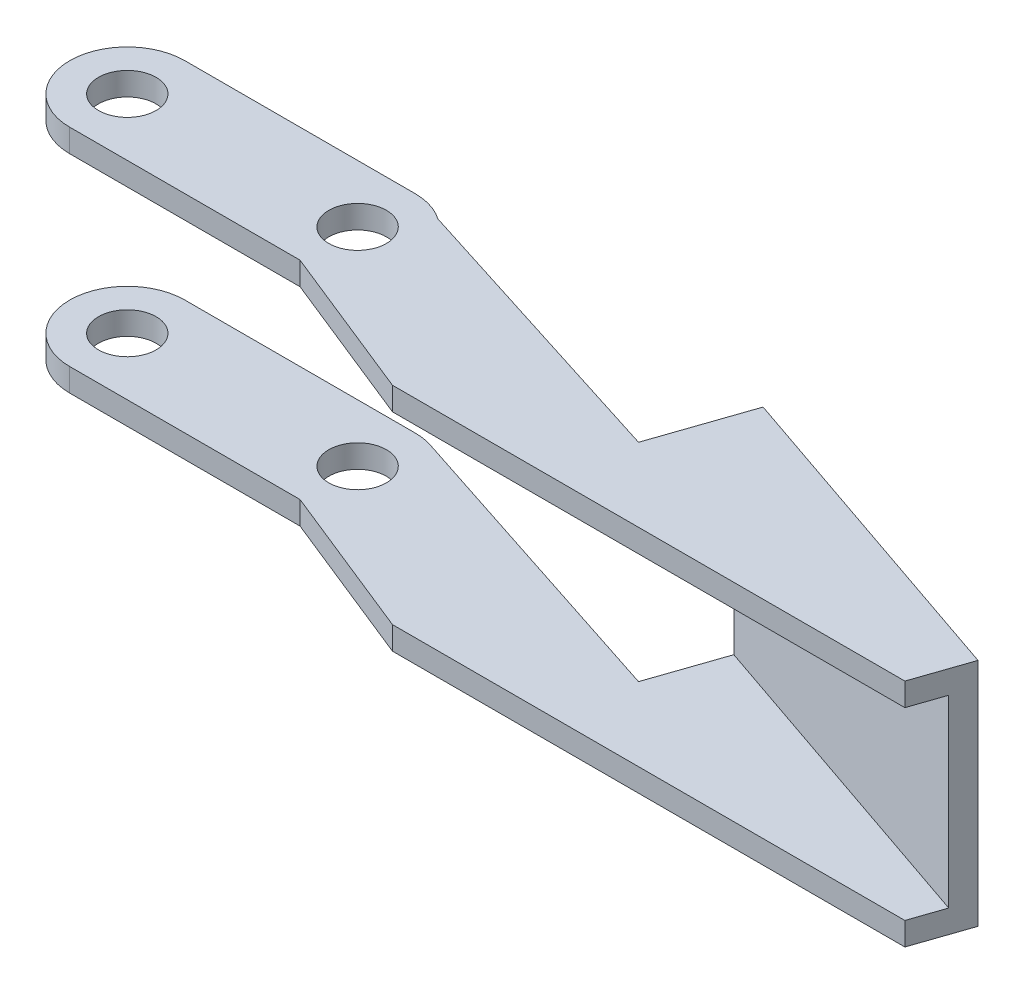
ISO-10303-21;
HEADER;
FILE_DESCRIPTION(('STEP AP214'),'2;1');
FILE_NAME('part.step','',(''),(''),'','','');
FILE_SCHEMA(('AUTOMOTIVE_DESIGN { 1 0 10303 214 1 1 1 1 }'));
ENDSEC;
DATA;
#1=APPLICATION_CONTEXT('core data for automotive mechanical design processes');
#2=APPLICATION_PROTOCOL_DEFINITION('international standard','automotive_design',2000,#1);
#3=PRODUCT_CONTEXT('',#1,'mechanical');
#4=PRODUCT('Part','Part','',(#3));
#5=PRODUCT_RELATED_PRODUCT_CATEGORY('part','',(#4));
#6=PRODUCT_DEFINITION_FORMATION('','',#4);
#7=PRODUCT_DEFINITION_CONTEXT('part definition',#1,'design');
#8=PRODUCT_DEFINITION('design','',#6,#7);
#9=PRODUCT_DEFINITION_SHAPE('','',#8);
#10=(LENGTH_UNIT() NAMED_UNIT(*) SI_UNIT(.MILLI.,.METRE.));
#11=(NAMED_UNIT(*) PLANE_ANGLE_UNIT() SI_UNIT($,.RADIAN.));
#12=(NAMED_UNIT(*) SI_UNIT($,.STERADIAN.) SOLID_ANGLE_UNIT());
#13=UNCERTAINTY_MEASURE_WITH_UNIT(LENGTH_MEASURE(1.E-05),#10,'distance_accuracy_value','');
#14=(GEOMETRIC_REPRESENTATION_CONTEXT(3) GLOBAL_UNCERTAINTY_ASSIGNED_CONTEXT((#13)) GLOBAL_UNIT_ASSIGNED_CONTEXT((#10,
#11,#12)) REPRESENTATION_CONTEXT('',''));
#15=CARTESIAN_POINT('',(0.,0.,0.));
#16=DIRECTION('',(0.,0.,1.));
#17=DIRECTION('',(1.,0.,0.));
#18=AXIS2_PLACEMENT_3D('',#15,#16,#17);
#19=CARTESIAN_POINT('',(0.,0.,0.));
#20=DIRECTION('',(0.,1.,0.));
#21=DIRECTION('',(0.,0.,1.));
#22=AXIS2_PLACEMENT_3D('',#19,#20,#21);
#23=PLANE('',#22);
#24=CARTESIAN_POINT('',(0.,0.,0.));
#25=DIRECTION('',(0.,1.,0.));
#26=DIRECTION('',(0.,0.,1.));
#27=AXIS2_PLACEMENT_3D('',#24,#25,#26);
#28=CIRCLE('',#27,2.5);
#29=CARTESIAN_POINT('',(0.,0.,2.5));
#30=VERTEX_POINT('',#29);
#31=EDGE_CURVE('E278',#30,#30,#28,.T.);
#32=ORIENTED_EDGE('',*,*,#31,.T.);
#33=EDGE_LOOP('',(#32));
#34=FACE_BOUND('',#33,.T.);
#35=DIRECTION('',(-0.497805283352229,0.,0.867288821481407));
#36=VECTOR('',#35,1.);
#37=CARTESIAN_POINT('',(24.3174095752577,0.,-2.52189899866607));
#38=LINE('',#37,#36);
#39=CARTESIAN_POINT('',(22.2751821786996,0.,1.03612067527275));
#40=VERTEX_POINT('',#39);
#41=CARTESIAN_POINT('',(22.0422273965581,0.,1.44198032606118));
#42=VERTEX_POINT('',#41);
#43=EDGE_CURVE('E228',#40,#42,#38,.T.);
#44=ORIENTED_EDGE('',*,*,#43,.F.);
#45=CARTESIAN_POINT('',(20.,0.,0.));
#46=DIRECTION('',(0.,1.,0.));
#47=DIRECTION('',(0.,0.,1.));
#48=AXIS2_PLACEMENT_3D('',#45,#46,#47);
#49=CIRCLE('',#48,2.5);
#50=EDGE_CURVE('E58',#40,#42,#49,.T.);
#51=ORIENTED_EDGE('',*,*,#50,.T.);
#52=EDGE_LOOP('',(#44,#51));
#53=FACE_BOUND('',#52,.T.);
#54=DIRECTION('',(-0.946071645942684,0.,-0.323957467491184));
#55=VECTOR('',#54,1.);
#56=CARTESIAN_POINT('',(50.5028094726619,0.,-2.16332017115032));
#57=LINE('',#56,#55);
#58=CARTESIAN_POINT('',(78.8849588509424,0.,7.55540385358519));
#59=VERTEX_POINT('',#58);
#60=CARTESIAN_POINT('',(50.5028094726619,0.,-2.16332017115032));
#61=VERTEX_POINT('',#60);
#62=EDGE_CURVE('E50',#59,#61,#57,.T.);
#63=ORIENTED_EDGE('',*,*,#62,.F.);
#64=DIRECTION('',(0.323957467491184,0.,-0.946071645942683));
#65=VECTOR('',#64,1.);
#66=CARTESIAN_POINT('',(79.5328737859248,0.,5.66326056169983));
#67=LINE('',#66,#65);
#68=CARTESIAN_POINT('',(77.9130864484688,0.,10.3936187914132));
#69=VERTEX_POINT('',#68);
#70=EDGE_CURVE('E238',#69,#59,#67,.T.);
#71=ORIENTED_EDGE('',*,*,#70,.F.);
#72=DIRECTION('',(1.,0.,0.));
#73=VECTOR('',#72,1.);
#74=CARTESIAN_POINT('',(77.9130864484688,0.,10.3936187914132));
#75=LINE('',#74,#73);
#76=CARTESIAN_POINT('',(33.4195191929236,0.,10.3936187914132));
#77=VERTEX_POINT('',#76);
#78=EDGE_CURVE('E235',#77,#69,#75,.T.);
#79=ORIENTED_EDGE('',*,*,#78,.F.);
#80=DIRECTION('',(0.927860020821441,0.,0.372928655055139));
#81=VECTOR('',#80,1.);
#82=CARTESIAN_POINT('',(33.4195191929236,0.,10.3936187914132));
#83=LINE('',#82,#81);
#84=CARTESIAN_POINT('',(20.,0.,5.));
#85=VERTEX_POINT('',#84);
#86=EDGE_CURVE('E231',#85,#77,#83,.T.);
#87=ORIENTED_EDGE('',*,*,#86,.F.);
#88=DIRECTION('',(1.,0.,0.));
#89=VECTOR('',#88,1.);
#90=CARTESIAN_POINT('',(0.,0.,5.));
#91=LINE('',#90,#89);
#92=CARTESIAN_POINT('',(0.,0.,5.));
#93=VERTEX_POINT('',#92);
#94=EDGE_CURVE('E300',#93,#85,#91,.T.);
#95=ORIENTED_EDGE('',*,*,#94,.F.);
#96=CARTESIAN_POINT('',(0.,0.,0.));
#97=DIRECTION('',(0.,1.,0.));
#98=DIRECTION('',(0.,0.,1.));
#99=AXIS2_PLACEMENT_3D('',#96,#97,#98);
#100=CIRCLE('',#99,5.);
#101=CARTESIAN_POINT('',(0.,0.,-5.));
#102=VERTEX_POINT('',#101);
#103=EDGE_CURVE('E283',#102,#93,#100,.T.);
#104=ORIENTED_EDGE('',*,*,#103,.F.);
#105=DIRECTION('',(-1.,0.,0.));
#106=VECTOR('',#105,1.);
#107=CARTESIAN_POINT('',(0.,0.,-5.));
#108=LINE('',#107,#106);
#109=CARTESIAN_POINT('',(20.,0.,-5.));
#110=VERTEX_POINT('',#109);
#111=EDGE_CURVE('E290',#110,#102,#108,.T.);
#112=ORIENTED_EDGE('',*,*,#111,.F.);
#113=CARTESIAN_POINT('',(20.,0.,0.));
#114=DIRECTION('',(0.,1.,0.));
#115=DIRECTION('',(0.,0.,1.));
#116=AXIS2_PLACEMENT_3D('',#113,#114,#115);
#117=CIRCLE('',#116,5.);
#118=CARTESIAN_POINT('',(22.8804418177824,0.,-4.08693710917727));
#119=VERTEX_POINT('',#118);
#120=EDGE_CURVE('E303',#119,#110,#117,.T.);
#121=ORIENTED_EDGE('',*,*,#120,.F.);
#122=DIRECTION('',(-0.953254274009682,0.,-0.30216930532778));
#123=VECTOR('',#122,1.);
#124=CARTESIAN_POINT('',(20.,0.,-5.));
#125=LINE('',#124,#123);
#126=CARTESIAN_POINT('',(48.3923399718755,0.,4.00000543385411));
#127=VERTEX_POINT('',#126);
#128=EDGE_CURVE('E242',#127,#119,#125,.T.);
#129=ORIENTED_EDGE('',*,*,#128,.F.);
#130=DIRECTION('',(-0.323957467491184,0.,0.946071645942684));
#131=VECTOR('',#130,1.);
#132=CARTESIAN_POINT('',(48.3923399718755,0.,4.00000543385411));
#133=LINE('',#132,#131);
#134=EDGE_CURVE('E240',#61,#127,#133,.T.);
#135=ORIENTED_EDGE('',*,*,#134,.F.);
#136=EDGE_LOOP('',(#63,#71,#79,#87,#95,#104,#112,#121,#129,#135));
#137=FACE_BOUND('',#136,.T.);
#138=ADVANCED_FACE('F35',(#34,#53,#137),#23,.F.);
#139=CARTESIAN_POINT('',(0.,2.,0.));
#140=DIRECTION('',(0.,1.,0.));
#141=DIRECTION('',(0.,0.,1.));
#142=AXIS2_PLACEMENT_3D('',#139,#140,#141);
#143=PLANE('',#142);
#144=CARTESIAN_POINT('',(20.,2.,0.));
#145=DIRECTION('',(0.,1.,0.));
#146=DIRECTION('',(0.,0.,1.));
#147=AXIS2_PLACEMENT_3D('',#144,#145,#146);
#148=CIRCLE('',#147,2.5);
#149=CARTESIAN_POINT('',(22.2751821786996,2.,1.03612067527274));
#150=VERTEX_POINT('',#149);
#151=CARTESIAN_POINT('',(22.0422273965581,2.,1.44198032606118));
#152=VERTEX_POINT('',#151);
#153=EDGE_CURVE('E276',#150,#152,#148,.T.);
#154=ORIENTED_EDGE('',*,*,#153,.F.);
#155=DIRECTION('',(-0.497805283352229,0.,0.867288821481407));
#156=VECTOR('',#155,1.);
#157=CARTESIAN_POINT('',(24.3174095752577,2.,-2.52189899866607));
#158=LINE('',#157,#156);
#159=EDGE_CURVE('E227',#150,#152,#158,.T.);
#160=ORIENTED_EDGE('',*,*,#159,.T.);
#161=EDGE_LOOP('',(#154,#160));
#162=FACE_BOUND('',#161,.T.);
#163=CARTESIAN_POINT('',(20.,2.,0.));
#164=DIRECTION('',(0.,1.,0.));
#165=DIRECTION('',(0.,0.,1.));
#166=AXIS2_PLACEMENT_3D('',#163,#164,#165);
#167=CIRCLE('',#166,5.);
#168=CARTESIAN_POINT('',(22.8804418177824,2.,-4.08693710917727));
#169=VERTEX_POINT('',#168);
#170=CARTESIAN_POINT('',(20.,2.,-5.));
#171=VERTEX_POINT('',#170);
#172=EDGE_CURVE('E293',#169,#171,#167,.T.);
#173=ORIENTED_EDGE('',*,*,#172,.T.);
#174=DIRECTION('',(-1.,0.,0.));
#175=VECTOR('',#174,1.);
#176=CARTESIAN_POINT('',(0.,2.,-5.));
#177=LINE('',#176,#175);
#178=CARTESIAN_POINT('',(0.,2.,-5.));
#179=VERTEX_POINT('',#178);
#180=EDGE_CURVE('E295',#171,#179,#177,.T.);
#181=ORIENTED_EDGE('',*,*,#180,.T.);
#182=CARTESIAN_POINT('',(0.,2.,0.));
#183=DIRECTION('',(0.,1.,0.));
#184=DIRECTION('',(0.,0.,1.));
#185=AXIS2_PLACEMENT_3D('',#182,#183,#184);
#186=CIRCLE('',#185,5.);
#187=CARTESIAN_POINT('',(0.,2.,5.));
#188=VERTEX_POINT('',#187);
#189=EDGE_CURVE('E286',#179,#188,#186,.T.);
#190=ORIENTED_EDGE('',*,*,#189,.T.);
#191=DIRECTION('',(1.,0.,0.));
#192=VECTOR('',#191,1.);
#193=CARTESIAN_POINT('',(0.,2.,5.));
#194=LINE('',#193,#192);
#195=CARTESIAN_POINT('',(20.,2.,5.));
#196=VERTEX_POINT('',#195);
#197=EDGE_CURVE('E289',#188,#196,#194,.T.);
#198=ORIENTED_EDGE('',*,*,#197,.T.);
#199=DIRECTION('',(0.927860020821441,0.,0.372928655055139));
#200=VECTOR('',#199,1.);
#201=CARTESIAN_POINT('',(33.4195191929236,2.,10.3936187914132));
#202=LINE('',#201,#200);
#203=CARTESIAN_POINT('',(33.4195191929236,2.,10.3936187914132));
#204=VERTEX_POINT('',#203);
#205=EDGE_CURVE('E247',#196,#204,#202,.T.);
#206=ORIENTED_EDGE('',*,*,#205,.T.);
#207=DIRECTION('',(1.,0.,0.));
#208=VECTOR('',#207,1.);
#209=CARTESIAN_POINT('',(77.9130864484688,2.,10.3936187914132));
#210=LINE('',#209,#208);
#211=CARTESIAN_POINT('',(77.9130864484688,2.,10.3936187914132));
#212=VERTEX_POINT('',#211);
#213=EDGE_CURVE('E250',#204,#212,#210,.T.);
#214=ORIENTED_EDGE('',*,*,#213,.T.);
#215=DIRECTION('',(0.323957467491184,0.,-0.946071645942683));
#216=VECTOR('',#215,1.);
#217=CARTESIAN_POINT('',(79.5328737859248,2.,5.66326056169983));
#218=LINE('',#217,#216);
#219=CARTESIAN_POINT('',(79.5328737859248,2.,5.66326056169983));
#220=VERTEX_POINT('',#219);
#221=EDGE_CURVE('E253',#212,#220,#218,.T.);
#222=ORIENTED_EDGE('',*,*,#221,.T.);
#223=DIRECTION('',(-0.946071645942684,0.,-0.323957467491184));
#224=VECTOR('',#223,1.);
#225=CARTESIAN_POINT('',(51.1507244076443,2.,-4.05546346303569));
#226=LINE('',#225,#224);
#227=CARTESIAN_POINT('',(51.1507244076443,2.,-4.05546346303569));
#228=VERTEX_POINT('',#227);
#229=EDGE_CURVE('E256',#220,#228,#226,.T.);
#230=ORIENTED_EDGE('',*,*,#229,.T.);
#231=DIRECTION('',(-0.323957467491184,0.,0.946071645942684));
#232=VECTOR('',#231,1.);
#233=CARTESIAN_POINT('',(48.3923399718755,2.,4.00000543385411));
#234=LINE('',#233,#232);
#235=CARTESIAN_POINT('',(48.3923399718755,2.,4.00000543385411));
#236=VERTEX_POINT('',#235);
#237=EDGE_CURVE('E259',#228,#236,#234,.T.);
#238=ORIENTED_EDGE('',*,*,#237,.T.);
#239=DIRECTION('',(-0.953254274009682,0.,-0.30216930532778));
#240=VECTOR('',#239,1.);
#241=CARTESIAN_POINT('',(20.,2.,-5.));
#242=LINE('',#241,#240);
#243=EDGE_CURVE('E232',#236,#169,#242,.T.);
#244=ORIENTED_EDGE('',*,*,#243,.T.);
#245=EDGE_LOOP('',(#173,#181,#190,#198,#206,#214,#222,#230,#238,#244));
#246=FACE_BOUND('',#245,.T.);
#247=CARTESIAN_POINT('',(0.,2.,0.));
#248=DIRECTION('',(0.,1.,0.));
#249=DIRECTION('',(0.,0.,1.));
#250=AXIS2_PLACEMENT_3D('',#247,#248,#249);
#251=CIRCLE('',#250,2.5);
#252=CARTESIAN_POINT('',(0.,2.,2.5));
#253=VERTEX_POINT('',#252);
#254=EDGE_CURVE('E280',#253,#253,#251,.T.);
#255=ORIENTED_EDGE('',*,*,#254,.F.);
#256=EDGE_LOOP('',(#255));
#257=FACE_BOUND('',#256,.T.);
#258=ADVANCED_FACE('F321',(#162,#246,#257),#143,.T.);
#259=CARTESIAN_POINT('',(0.,2.,0.));
#260=DIRECTION('',(0.,-1.,0.));
#261=DIRECTION('',(0.,0.,-1.));
#262=AXIS2_PLACEMENT_3D('',#259,#260,#261);
#263=CYLINDRICAL_SURFACE('',#262,5.);
#264=ORIENTED_EDGE('',*,*,#103,.T.);
#265=DIRECTION('',(0.,-1.,0.));
#266=VECTOR('',#265,1.);
#267=CARTESIAN_POINT('',(0.,2.,5.));
#268=LINE('',#267,#266);
#269=EDGE_CURVE('E313',#188,#93,#268,.T.);
#270=ORIENTED_EDGE('',*,*,#269,.F.);
#271=ORIENTED_EDGE('',*,*,#189,.F.);
#272=DIRECTION('',(0.,-1.,0.));
#273=VECTOR('',#272,1.);
#274=CARTESIAN_POINT('',(0.,2.,-5.));
#275=LINE('',#274,#273);
#276=EDGE_CURVE('E297',#179,#102,#275,.T.);
#277=ORIENTED_EDGE('',*,*,#276,.T.);
#278=EDGE_LOOP('',(#264,#270,#271,#277));
#279=FACE_BOUND('',#278,.T.);
#280=ADVANCED_FACE('F37',(#279),#263,.T.);
#281=CARTESIAN_POINT('',(0.,2.,5.));
#282=DIRECTION('',(0.,0.,-1.));
#283=DIRECTION('',(-1.,0.,0.));
#284=AXIS2_PLACEMENT_3D('',#281,#282,#283);
#285=PLANE('',#284);
#286=ORIENTED_EDGE('',*,*,#94,.T.);
#287=DIRECTION('',(0.,-1.,0.));
#288=VECTOR('',#287,1.);
#289=CARTESIAN_POINT('',(20.,2.,5.));
#290=LINE('',#289,#288);
#291=EDGE_CURVE('E311',#196,#85,#290,.T.);
#292=ORIENTED_EDGE('',*,*,#291,.F.);
#293=ORIENTED_EDGE('',*,*,#197,.F.);
#294=ORIENTED_EDGE('',*,*,#269,.T.);
#295=EDGE_LOOP('',(#286,#292,#293,#294));
#296=FACE_BOUND('',#295,.T.);
#297=ADVANCED_FACE('F341',(#296),#285,.F.);
#298=CARTESIAN_POINT('',(20.,2.,0.));
#299=DIRECTION('',(0.,-1.,0.));
#300=DIRECTION('',(0.,0.,-1.));
#301=AXIS2_PLACEMENT_3D('',#298,#299,#300);
#302=CYLINDRICAL_SURFACE('',#301,5.);
#303=ORIENTED_EDGE('',*,*,#172,.F.);
#304=DIRECTION('',(0.,-1.,0.));
#305=VECTOR('',#304,1.);
#306=CARTESIAN_POINT('',(22.8804418177824,2.,-4.08693710917727));
#307=LINE('',#306,#305);
#308=EDGE_CURVE('E266',#169,#119,#307,.T.);
#309=ORIENTED_EDGE('',*,*,#308,.T.);
#310=ORIENTED_EDGE('',*,*,#120,.T.);
#311=DIRECTION('',(0.,-1.,0.));
#312=VECTOR('',#311,1.);
#313=CARTESIAN_POINT('',(20.,2.,-5.));
#314=LINE('',#313,#312);
#315=EDGE_CURVE('E308',#171,#110,#314,.T.);
#316=ORIENTED_EDGE('',*,*,#315,.F.);
#317=EDGE_LOOP('',(#303,#309,#310,#316));
#318=FACE_BOUND('',#317,.T.);
#319=ADVANCED_FACE('F338',(#318),#302,.T.);
#320=CARTESIAN_POINT('',(0.,2.,-5.));
#321=DIRECTION('',(0.,0.,1.));
#322=DIRECTION('',(1.,0.,0.));
#323=AXIS2_PLACEMENT_3D('',#320,#321,#322);
#324=PLANE('',#323);
#325=ORIENTED_EDGE('',*,*,#111,.T.);
#326=ORIENTED_EDGE('',*,*,#276,.F.);
#327=ORIENTED_EDGE('',*,*,#180,.F.);
#328=ORIENTED_EDGE('',*,*,#315,.T.);
#329=EDGE_LOOP('',(#325,#326,#327,#328));
#330=FACE_BOUND('',#329,.T.);
#331=ADVANCED_FACE('F334',(#330),#324,.F.);
#332=CARTESIAN_POINT('',(0.,2.,0.));
#333=DIRECTION('',(0.,-1.,0.));
#334=DIRECTION('',(0.,0.,-1.));
#335=AXIS2_PLACEMENT_3D('',#332,#333,#334);
#336=CYLINDRICAL_SURFACE('',#335,2.5);
#337=ORIENTED_EDGE('',*,*,#254,.T.);
#338=EDGE_LOOP('',(#337));
#339=FACE_BOUND('',#338,.T.);
#340=ORIENTED_EDGE('',*,*,#31,.F.);
#341=EDGE_LOOP('',(#340));
#342=FACE_BOUND('',#341,.T.);
#343=ADVANCED_FACE('F337',(#339,#342),#336,.F.);
#344=CARTESIAN_POINT('',(20.,2.,0.));
#345=DIRECTION('',(0.,-1.,0.));
#346=DIRECTION('',(0.,0.,-1.));
#347=AXIS2_PLACEMENT_3D('',#344,#345,#346);
#348=CYLINDRICAL_SURFACE('',#347,2.5);
#349=DIRECTION('',(0.,-1.,0.));
#350=VECTOR('',#349,1.);
#351=CARTESIAN_POINT('',(22.2751821786996,2.,1.03612067527273));
#352=LINE('',#351,#350);
#353=EDGE_CURVE('E11',#150,#40,#352,.T.);
#354=ORIENTED_EDGE('',*,*,#353,.F.);
#355=ORIENTED_EDGE('',*,*,#153,.T.);
#356=DIRECTION('',(0.,-1.,0.));
#357=VECTOR('',#356,1.);
#358=CARTESIAN_POINT('',(22.0422273965581,2.,1.4419803260612));
#359=LINE('',#358,#357);
#360=EDGE_CURVE('E43',#42,#152,#359,.F.);
#361=ORIENTED_EDGE('',*,*,#360,.F.);
#362=ORIENTED_EDGE('',*,*,#50,.F.);
#363=EDGE_LOOP('',(#354,#355,#361,#362));
#364=FACE_BOUND('',#363,.T.);
#365=ADVANCED_FACE('F323',(#364),#348,.F.);
#366=CARTESIAN_POINT('',(24.3174095752577,0.,-2.52189899866607));
#367=DIRECTION('',(-0.867288821481407,0.,-0.497805283352229));
#368=DIRECTION('',(-0.497805283352229,0.,0.867288821481407));
#369=AXIS2_PLACEMENT_3D('',#366,#367,#368);
#370=PLANE('',#369);
#371=ORIENTED_EDGE('',*,*,#159,.F.);
#372=ORIENTED_EDGE('',*,*,#353,.T.);
#373=ORIENTED_EDGE('',*,*,#43,.T.);
#374=ORIENTED_EDGE('',*,*,#360,.T.);
#375=EDGE_LOOP('',(#371,#372,#373,#374));
#376=FACE_BOUND('',#375,.T.);
#377=ADVANCED_FACE('F318',(#376),#370,.T.);
#378=CARTESIAN_POINT('',(20.,0.,-5.));
#379=DIRECTION('',(0.30216930532778,0.,-0.953254274009682));
#380=DIRECTION('',(-0.953254274009682,0.,-0.30216930532778));
#381=AXIS2_PLACEMENT_3D('',#378,#379,#380);
#382=PLANE('',#381);
#383=ORIENTED_EDGE('',*,*,#308,.F.);
#384=ORIENTED_EDGE('',*,*,#243,.F.);
#385=DIRECTION('',(0.,1.,0.));
#386=VECTOR('',#385,1.);
#387=CARTESIAN_POINT('',(48.3923399718755,0.,4.00000543385411));
#388=LINE('',#387,#386);
#389=EDGE_CURVE('E264',#127,#236,#388,.T.);
#390=ORIENTED_EDGE('',*,*,#389,.F.);
#391=ORIENTED_EDGE('',*,*,#128,.T.);
#392=EDGE_LOOP('',(#383,#384,#390,#391));
#393=FACE_BOUND('',#392,.T.);
#394=ADVANCED_FACE('F368',(#393),#382,.T.);
#395=CARTESIAN_POINT('',(48.3923399718755,0.,4.00000543385411));
#396=DIRECTION('',(-0.946071645942684,0.,-0.323957467491184));
#397=DIRECTION('',(-0.323957467491184,0.,0.946071645942684));
#398=AXIS2_PLACEMENT_3D('',#395,#396,#397);
#399=PLANE('',#398);
#400=ORIENTED_EDGE('',*,*,#237,.F.);
#401=DIRECTION('',(0.,1.,0.));
#402=VECTOR('',#401,1.);
#403=CARTESIAN_POINT('',(51.1507244076443,0.,-4.05546346303569));
#404=LINE('',#403,#402);
#405=CARTESIAN_POINT('',(51.1507244076443,-18.,-4.05546346303569));
#406=VERTEX_POINT('',#405);
#407=EDGE_CURVE('E267',#406,#228,#404,.T.);
#408=ORIENTED_EDGE('',*,*,#407,.F.);
#409=DIRECTION('',(-0.323957467491184,0.,0.946071645942684));
#410=VECTOR('',#409,1.);
#411=CARTESIAN_POINT('',(44.5395889112522,-18.,15.2514161994681));
#412=LINE('',#411,#410);
#413=CARTESIAN_POINT('',(48.3923399718755,-18.,4.00000543385411));
#414=VERTEX_POINT('',#413);
#415=EDGE_CURVE('E396',#406,#414,#412,.T.);
#416=ORIENTED_EDGE('',*,*,#415,.T.);
#417=DIRECTION('',(0.,1.,0.));
#418=VECTOR('',#417,1.);
#419=CARTESIAN_POINT('',(48.3923399718755,-18.,4.00000543385411));
#420=LINE('',#419,#418);
#421=CARTESIAN_POINT('',(48.3923399718755,-16.,4.00000543385411));
#422=VERTEX_POINT('',#421);
#423=EDGE_CURVE('E215',#414,#422,#420,.T.);
#424=ORIENTED_EDGE('',*,*,#423,.T.);
#425=DIRECTION('',(-0.323957467491184,0.,0.946071645942684));
#426=VECTOR('',#425,1.);
#427=CARTESIAN_POINT('',(44.5395889112522,-16.,15.2514161994681));
#428=LINE('',#427,#426);
#429=CARTESIAN_POINT('',(50.5028094726619,-16.,-2.16332017115032));
#430=VERTEX_POINT('',#429);
#431=EDGE_CURVE('E424',#430,#422,#428,.T.);
#432=ORIENTED_EDGE('',*,*,#431,.F.);
#433=DIRECTION('',(0.,1.,0.));
#434=VECTOR('',#433,1.);
#435=CARTESIAN_POINT('',(50.5028094726619,-16.,-2.16332017115032));
#436=LINE('',#435,#434);
#437=EDGE_CURVE('E220',#430,#61,#436,.T.);
#438=ORIENTED_EDGE('',*,*,#437,.T.);
#439=ORIENTED_EDGE('',*,*,#134,.T.);
#440=ORIENTED_EDGE('',*,*,#389,.T.);
#441=EDGE_LOOP('',(#400,#408,#416,#424,#432,#438,#439,#440));
#442=FACE_BOUND('',#441,.T.);
#443=ADVANCED_FACE('F373',(#442),#399,.T.);
#444=CARTESIAN_POINT('',(51.1507244076443,0.,-4.05546346303569));
#445=DIRECTION('',(0.323957467491184,0.,-0.946071645942684));
#446=DIRECTION('',(-0.946071645942684,0.,-0.323957467491184));
#447=AXIS2_PLACEMENT_3D('',#444,#445,#446);
#448=PLANE('',#447);
#449=ORIENTED_EDGE('',*,*,#229,.F.);
#450=DIRECTION('',(0.,1.,0.));
#451=VECTOR('',#450,1.);
#452=CARTESIAN_POINT('',(79.5328737859248,0.,5.66326056169983));
#453=LINE('',#452,#451);
#454=CARTESIAN_POINT('',(79.5328737859248,-18.,5.66326056169983));
#455=VERTEX_POINT('',#454);
#456=EDGE_CURVE('E269',#455,#220,#453,.T.);
#457=ORIENTED_EDGE('',*,*,#456,.F.);
#458=DIRECTION('',(0.946071645942684,0.,0.323957467491184));
#459=VECTOR('',#458,1.);
#460=CARTESIAN_POINT('',(6.61113549639208,-18.,-19.3068796625038));
#461=LINE('',#460,#459);
#462=EDGE_CURVE('E394',#406,#455,#461,.T.);
#463=ORIENTED_EDGE('',*,*,#462,.F.);
#464=ORIENTED_EDGE('',*,*,#407,.T.);
#465=EDGE_LOOP('',(#449,#457,#463,#464));
#466=FACE_BOUND('',#465,.T.);
#467=ADVANCED_FACE('F393',(#466),#448,.T.);
#468=CARTESIAN_POINT('',(79.5328737859248,0.,5.66326056169983));
#469=DIRECTION('',(0.946071645942684,0.,0.323957467491184));
#470=DIRECTION('',(0.323957467491184,0.,-0.946071645942684));
#471=AXIS2_PLACEMENT_3D('',#468,#469,#470);
#472=PLANE('',#471);
#473=ORIENTED_EDGE('',*,*,#221,.F.);
#474=DIRECTION('',(0.,1.,0.));
#475=VECTOR('',#474,1.);
#476=CARTESIAN_POINT('',(77.9130864484688,0.,10.3936187914132));
#477=LINE('',#476,#475);
#478=EDGE_CURVE('E271',#69,#212,#477,.T.);
#479=ORIENTED_EDGE('',*,*,#478,.F.);
#480=ORIENTED_EDGE('',*,*,#70,.T.);
#481=DIRECTION('',(0.,1.,0.));
#482=VECTOR('',#481,1.);
#483=CARTESIAN_POINT('',(78.8849588509424,-16.,7.55540385358519));
#484=LINE('',#483,#482);
#485=CARTESIAN_POINT('',(78.8849588509424,-16.,7.55540385358519));
#486=VERTEX_POINT('',#485);
#487=EDGE_CURVE('E224',#486,#59,#484,.T.);
#488=ORIENTED_EDGE('',*,*,#487,.F.);
#489=DIRECTION('',(-0.323957467491187,0.,0.946071645942683));
#490=VECTOR('',#489,1.);
#491=CARTESIAN_POINT('',(72.9217382895325,-16.,24.9701402242038));
#492=LINE('',#491,#490);
#493=CARTESIAN_POINT('',(77.9130864484688,-16.,10.3936187914132));
#494=VERTEX_POINT('',#493);
#495=EDGE_CURVE('E385',#486,#494,#492,.T.);
#496=ORIENTED_EDGE('',*,*,#495,.T.);
#497=DIRECTION('',(0.,1.,0.));
#498=VECTOR('',#497,1.);
#499=CARTESIAN_POINT('',(77.9130864484688,-18.,10.3936187914132));
#500=LINE('',#499,#498);
#501=CARTESIAN_POINT('',(77.9130864484688,-18.,10.3936187914132));
#502=VERTEX_POINT('',#501);
#503=EDGE_CURVE('E446',#502,#494,#500,.T.);
#504=ORIENTED_EDGE('',*,*,#503,.F.);
#505=DIRECTION('',(-0.323957467491187,0.,0.946071645942683));
#506=VECTOR('',#505,1.);
#507=CARTESIAN_POINT('',(72.9217382895325,-18.,24.9701402242038));
#508=LINE('',#507,#506);
#509=EDGE_CURVE('E390',#455,#502,#508,.T.);
#510=ORIENTED_EDGE('',*,*,#509,.F.);
#511=ORIENTED_EDGE('',*,*,#456,.T.);
#512=EDGE_LOOP('',(#473,#479,#480,#488,#496,#504,#510,#511));
#513=FACE_BOUND('',#512,.T.);
#514=ADVANCED_FACE('F383',(#513),#472,.T.);
#515=CARTESIAN_POINT('',(77.9130864484688,0.,10.3936187914132));
#516=DIRECTION('',(0.,0.,1.));
#517=DIRECTION('',(1.,0.,0.));
#518=AXIS2_PLACEMENT_3D('',#515,#516,#517);
#519=PLANE('',#518);
#520=ORIENTED_EDGE('',*,*,#213,.F.);
#521=DIRECTION('',(0.,1.,0.));
#522=VECTOR('',#521,1.);
#523=CARTESIAN_POINT('',(33.4195191929236,0.,10.3936187914132));
#524=LINE('',#523,#522);
#525=EDGE_CURVE('E244',#77,#204,#524,.T.);
#526=ORIENTED_EDGE('',*,*,#525,.F.);
#527=ORIENTED_EDGE('',*,*,#78,.T.);
#528=ORIENTED_EDGE('',*,*,#478,.T.);
#529=EDGE_LOOP('',(#520,#526,#527,#528));
#530=FACE_BOUND('',#529,.T.);
#531=ADVANCED_FACE('F388',(#530),#519,.T.);
#532=CARTESIAN_POINT('',(33.4195191929236,0.,10.3936187914132));
#533=DIRECTION('',(-0.372928655055139,0.,0.927860020821441));
#534=DIRECTION('',(0.927860020821441,0.,0.372928655055139));
#535=AXIS2_PLACEMENT_3D('',#532,#533,#534);
#536=PLANE('',#535);
#537=ORIENTED_EDGE('',*,*,#205,.F.);
#538=ORIENTED_EDGE('',*,*,#291,.T.);
#539=ORIENTED_EDGE('',*,*,#86,.T.);
#540=ORIENTED_EDGE('',*,*,#525,.T.);
#541=EDGE_LOOP('',(#537,#538,#539,#540));
#542=FACE_BOUND('',#541,.T.);
#543=ADVANCED_FACE('F356',(#542),#536,.T.);
#544=CARTESIAN_POINT('',(50.5028094726619,-16.,-2.16332017115032));
#545=DIRECTION('',(0.323957467491184,0.,-0.946071645942684));
#546=DIRECTION('',(-0.946071645942684,0.,-0.323957467491184));
#547=AXIS2_PLACEMENT_3D('',#544,#545,#546);
#548=PLANE('',#547);
#549=ORIENTED_EDGE('',*,*,#62,.T.);
#550=ORIENTED_EDGE('',*,*,#437,.F.);
#551=DIRECTION('',(-0.946071645942684,0.,-0.323957467491184));
#552=VECTOR('',#551,1.);
#553=CARTESIAN_POINT('',(50.5028094726619,-16.,-2.16332017115032));
#554=LINE('',#553,#552);
#555=EDGE_CURVE('E213',#486,#430,#554,.T.);
#556=ORIENTED_EDGE('',*,*,#555,.F.);
#557=ORIENTED_EDGE('',*,*,#487,.T.);
#558=EDGE_LOOP('',(#549,#550,#556,#557));
#559=FACE_BOUND('',#558,.T.);
#560=ADVANCED_FACE('F378',(#559),#548,.F.);
#561=CARTESIAN_POINT('',(0.,-16.,0.));
#562=DIRECTION('',(0.,-1.,0.));
#563=DIRECTION('',(0.,0.,-1.));
#564=AXIS2_PLACEMENT_3D('',#561,#562,#563);
#565=PLANE('',#564);
#566=CARTESIAN_POINT('',(20.,-16.,0.));
#567=DIRECTION('',(0.,-1.,0.));
#568=DIRECTION('',(0.,0.,-1.));
#569=AXIS2_PLACEMENT_3D('',#566,#567,#568);
#570=CIRCLE('',#569,2.5);
#571=CARTESIAN_POINT('',(20.,-16.,-2.5));
#572=VERTEX_POINT('',#571);
#573=EDGE_CURVE('E412',#572,#572,#570,.T.);
#574=ORIENTED_EDGE('',*,*,#573,.T.);
#575=EDGE_LOOP('',(#574));
#576=FACE_BOUND('',#575,.T.);
#577=CARTESIAN_POINT('',(0.,-16.,0.));
#578=DIRECTION('',(0.,-1.,0.));
#579=DIRECTION('',(0.,0.,-1.));
#580=AXIS2_PLACEMENT_3D('',#577,#578,#579);
#581=CIRCLE('',#580,2.5);
#582=CARTESIAN_POINT('',(0.,-16.,-2.5));
#583=VERTEX_POINT('',#582);
#584=EDGE_CURVE('E415',#583,#583,#581,.T.);
#585=ORIENTED_EDGE('',*,*,#584,.T.);
#586=EDGE_LOOP('',(#585));
#587=FACE_BOUND('',#586,.T.);
#588=ORIENTED_EDGE('',*,*,#495,.F.);
#589=ORIENTED_EDGE('',*,*,#555,.T.);
#590=ORIENTED_EDGE('',*,*,#431,.T.);
#591=DIRECTION('',(-0.950723872207402,0.,-0.310038898873938));
#592=VECTOR('',#591,1.);
#593=CARTESIAN_POINT('',(3.47262390561093,-16.,-10.6486845949121));
#594=LINE('',#593,#592);
#595=CARTESIAN_POINT('',(21.5108465266389,-16.,-4.76627137004842));
#596=VERTEX_POINT('',#595);
#597=EDGE_CURVE('E421',#422,#596,#594,.T.);
#598=ORIENTED_EDGE('',*,*,#597,.T.);
#599=CARTESIAN_POINT('',(20.,-16.,0.));
#600=DIRECTION('',(0.,-1.,0.));
#601=DIRECTION('',(0.,0.,-1.));
#602=AXIS2_PLACEMENT_3D('',#599,#600,#601);
#603=CIRCLE('',#602,5.);
#604=CARTESIAN_POINT('',(20.,-16.,-5.));
#605=VERTEX_POINT('',#604);
#606=EDGE_CURVE('E419',#605,#596,#603,.T.);
#607=ORIENTED_EDGE('',*,*,#606,.F.);
#608=DIRECTION('',(1.,0.,0.));
#609=VECTOR('',#608,1.);
#610=CARTESIAN_POINT('',(0.,-16.,-5.));
#611=LINE('',#610,#609);
#612=CARTESIAN_POINT('',(0.,-16.,-5.));
#613=VERTEX_POINT('',#612);
#614=EDGE_CURVE('E211',#613,#605,#611,.T.);
#615=ORIENTED_EDGE('',*,*,#614,.F.);
#616=CARTESIAN_POINT('',(0.,-16.,0.));
#617=DIRECTION('',(0.,-1.,0.));
#618=DIRECTION('',(0.,0.,-1.));
#619=AXIS2_PLACEMENT_3D('',#616,#617,#618);
#620=CIRCLE('',#619,5.);
#621=CARTESIAN_POINT('',(0.,-16.,5.));
#622=VERTEX_POINT('',#621);
#623=EDGE_CURVE('E435',#622,#613,#620,.T.);
#624=ORIENTED_EDGE('',*,*,#623,.F.);
#625=DIRECTION('',(1.,0.,0.));
#626=VECTOR('',#625,1.);
#627=CARTESIAN_POINT('',(0.,-16.,5.));
#628=LINE('',#627,#626);
#629=CARTESIAN_POINT('',(20.,-16.,5.));
#630=VERTEX_POINT('',#629);
#631=EDGE_CURVE('E432',#622,#630,#628,.T.);
#632=ORIENTED_EDGE('',*,*,#631,.T.);
#633=DIRECTION('',(-0.927860020821441,0.,-0.372928655055139));
#634=VECTOR('',#633,1.);
#635=CARTESIAN_POINT('',(1.05138768700283,-16.,-2.61589070169364));
#636=LINE('',#635,#634);
#637=CARTESIAN_POINT('',(33.4195191929236,-16.,10.3936187914132));
#638=VERTEX_POINT('',#637);
#639=EDGE_CURVE('E429',#638,#630,#636,.T.);
#640=ORIENTED_EDGE('',*,*,#639,.F.);
#641=DIRECTION('',(-1.,0.,0.));
#642=VECTOR('',#641,1.);
#643=CARTESIAN_POINT('',(0.,-16.,10.3936187914133));
#644=LINE('',#643,#642);
#645=EDGE_CURVE('E427',#494,#638,#644,.T.);
#646=ORIENTED_EDGE('',*,*,#645,.F.);
#647=EDGE_LOOP('',(#588,#589,#590,#598,#607,#615,#624,#632,#640,#646));
#648=FACE_BOUND('',#647,.T.);
#649=ADVANCED_FACE('F451',(#576,#587,#648),#565,.F.);
#650=CARTESIAN_POINT('',(0.,-18.,-5.));
#651=DIRECTION('',(0.,0.,1.));
#652=DIRECTION('',(1.,0.,0.));
#653=AXIS2_PLACEMENT_3D('',#650,#651,#652);
#654=PLANE('',#653);
#655=ORIENTED_EDGE('',*,*,#614,.T.);
#656=DIRECTION('',(0.,1.,0.));
#657=VECTOR('',#656,1.);
#658=CARTESIAN_POINT('',(20.,-18.,-5.));
#659=LINE('',#658,#657);
#660=CARTESIAN_POINT('',(20.,-18.,-5.));
#661=VERTEX_POINT('',#660);
#662=EDGE_CURVE('E190',#661,#605,#659,.T.);
#663=ORIENTED_EDGE('',*,*,#662,.F.);
#664=DIRECTION('',(1.,0.,0.));
#665=VECTOR('',#664,1.);
#666=CARTESIAN_POINT('',(0.,-18.,-5.));
#667=LINE('',#666,#665);
#668=CARTESIAN_POINT('',(0.,-18.,-5.));
#669=VERTEX_POINT('',#668);
#670=EDGE_CURVE('E197',#669,#661,#667,.T.);
#671=ORIENTED_EDGE('',*,*,#670,.F.);
#672=DIRECTION('',(0.,1.,0.));
#673=VECTOR('',#672,1.);
#674=CARTESIAN_POINT('',(0.,-18.,-5.));
#675=LINE('',#674,#673);
#676=EDGE_CURVE('E411',#669,#613,#675,.T.);
#677=ORIENTED_EDGE('',*,*,#676,.T.);
#678=EDGE_LOOP('',(#655,#663,#671,#677));
#679=FACE_BOUND('',#678,.T.);
#680=ADVANCED_FACE('F209',(#679),#654,.F.);
#681=CARTESIAN_POINT('',(20.,-18.,0.));
#682=DIRECTION('',(0.,1.,0.));
#683=DIRECTION('',(0.,0.,1.));
#684=AXIS2_PLACEMENT_3D('',#681,#682,#683);
#685=CYLINDRICAL_SURFACE('',#684,5.);
#686=ORIENTED_EDGE('',*,*,#606,.T.);
#687=DIRECTION('',(0.,1.,0.));
#688=VECTOR('',#687,1.);
#689=CARTESIAN_POINT('',(21.5108465266389,-18.,-4.76627137004842));
#690=LINE('',#689,#688);
#691=CARTESIAN_POINT('',(21.5108465266389,-18.,-4.76627137004842));
#692=VERTEX_POINT('',#691);
#693=EDGE_CURVE('E192',#692,#596,#690,.T.);
#694=ORIENTED_EDGE('',*,*,#693,.F.);
#695=CARTESIAN_POINT('',(20.,-18.,0.));
#696=DIRECTION('',(0.,-1.,0.));
#697=DIRECTION('',(0.,0.,-1.));
#698=AXIS2_PLACEMENT_3D('',#695,#696,#697);
#699=CIRCLE('',#698,5.);
#700=EDGE_CURVE('E185',#661,#692,#699,.T.);
#701=ORIENTED_EDGE('',*,*,#700,.F.);
#702=ORIENTED_EDGE('',*,*,#662,.T.);
#703=EDGE_LOOP('',(#686,#694,#701,#702));
#704=FACE_BOUND('',#703,.T.);
#705=ADVANCED_FACE('F188',(#704),#685,.T.);
#706=CARTESIAN_POINT('',(3.47262390561093,-18.,-10.6486845949121));
#707=DIRECTION('',(0.310038898873938,0.,-0.950723872207402));
#708=DIRECTION('',(-0.950723872207402,0.,-0.310038898873938));
#709=AXIS2_PLACEMENT_3D('',#706,#707,#708);
#710=PLANE('',#709);
#711=ORIENTED_EDGE('',*,*,#597,.F.);
#712=ORIENTED_EDGE('',*,*,#423,.F.);
#713=DIRECTION('',(-0.950723872207402,0.,-0.310038898873938));
#714=VECTOR('',#713,1.);
#715=CARTESIAN_POINT('',(3.47262390561093,-18.,-10.6486845949121));
#716=LINE('',#715,#714);
#717=EDGE_CURVE('E196',#414,#692,#716,.T.);
#718=ORIENTED_EDGE('',*,*,#717,.T.);
#719=ORIENTED_EDGE('',*,*,#693,.T.);
#720=EDGE_LOOP('',(#711,#712,#718,#719));
#721=FACE_BOUND('',#720,.T.);
#722=ADVANCED_FACE('F449',(#721),#710,.T.);
#723=CARTESIAN_POINT('',(0.,-18.,10.3936187914133));
#724=DIRECTION('',(0.,0.,-1.));
#725=DIRECTION('',(-1.,0.,0.));
#726=AXIS2_PLACEMENT_3D('',#723,#724,#725);
#727=PLANE('',#726);
#728=ORIENTED_EDGE('',*,*,#645,.T.);
#729=DIRECTION('',(0.,1.,0.));
#730=VECTOR('',#729,1.);
#731=CARTESIAN_POINT('',(33.4195191929236,-18.,10.3936187914132));
#732=LINE('',#731,#730);
#733=CARTESIAN_POINT('',(33.4195191929236,-18.,10.3936187914132));
#734=VERTEX_POINT('',#733);
#735=EDGE_CURVE('E443',#734,#638,#732,.T.);
#736=ORIENTED_EDGE('',*,*,#735,.F.);
#737=DIRECTION('',(-1.,0.,0.));
#738=VECTOR('',#737,1.);
#739=CARTESIAN_POINT('',(0.,-18.,10.3936187914133));
#740=LINE('',#739,#738);
#741=EDGE_CURVE('E403',#502,#734,#740,.T.);
#742=ORIENTED_EDGE('',*,*,#741,.F.);
#743=ORIENTED_EDGE('',*,*,#503,.T.);
#744=EDGE_LOOP('',(#728,#736,#742,#743));
#745=FACE_BOUND('',#744,.T.);
#746=ADVANCED_FACE('F456',(#745),#727,.F.);
#747=CARTESIAN_POINT('',(1.05138768700283,-18.,-2.61589070169364));
#748=DIRECTION('',(0.372928655055139,0.,-0.927860020821441));
#749=DIRECTION('',(-0.927860020821441,0.,-0.372928655055139));
#750=AXIS2_PLACEMENT_3D('',#747,#748,#749);
#751=PLANE('',#750);
#752=ORIENTED_EDGE('',*,*,#639,.T.);
#753=DIRECTION('',(0.,1.,0.));
#754=VECTOR('',#753,1.);
#755=CARTESIAN_POINT('',(20.,-18.,5.));
#756=LINE('',#755,#754);
#757=CARTESIAN_POINT('',(20.,-18.,5.));
#758=VERTEX_POINT('',#757);
#759=EDGE_CURVE('E441',#758,#630,#756,.T.);
#760=ORIENTED_EDGE('',*,*,#759,.F.);
#761=DIRECTION('',(-0.927860020821441,0.,-0.372928655055139));
#762=VECTOR('',#761,1.);
#763=CARTESIAN_POINT('',(1.05138768700283,-18.,-2.61589070169364));
#764=LINE('',#763,#762);
#765=EDGE_CURVE('E405',#734,#758,#764,.T.);
#766=ORIENTED_EDGE('',*,*,#765,.F.);
#767=ORIENTED_EDGE('',*,*,#735,.T.);
#768=EDGE_LOOP('',(#752,#760,#766,#767));
#769=FACE_BOUND('',#768,.T.);
#770=ADVANCED_FACE('F460',(#769),#751,.F.);
#771=CARTESIAN_POINT('',(0.,-18.,5.));
#772=DIRECTION('',(0.,0.,1.));
#773=DIRECTION('',(1.,0.,0.));
#774=AXIS2_PLACEMENT_3D('',#771,#772,#773);
#775=PLANE('',#774);
#776=ORIENTED_EDGE('',*,*,#631,.F.);
#777=DIRECTION('',(0.,1.,0.));
#778=VECTOR('',#777,1.);
#779=CARTESIAN_POINT('',(0.,-18.,5.));
#780=LINE('',#779,#778);
#781=CARTESIAN_POINT('',(0.,-18.,5.));
#782=VERTEX_POINT('',#781);
#783=EDGE_CURVE('E439',#782,#622,#780,.T.);
#784=ORIENTED_EDGE('',*,*,#783,.F.);
#785=DIRECTION('',(1.,0.,0.));
#786=VECTOR('',#785,1.);
#787=CARTESIAN_POINT('',(0.,-18.,5.));
#788=LINE('',#787,#786);
#789=EDGE_CURVE('E407',#782,#758,#788,.T.);
#790=ORIENTED_EDGE('',*,*,#789,.T.);
#791=ORIENTED_EDGE('',*,*,#759,.T.);
#792=EDGE_LOOP('',(#776,#784,#790,#791));
#793=FACE_BOUND('',#792,.T.);
#794=ADVANCED_FACE('F464',(#793),#775,.T.);
#795=CARTESIAN_POINT('',(0.,-18.,0.));
#796=DIRECTION('',(0.,1.,0.));
#797=DIRECTION('',(0.,0.,1.));
#798=AXIS2_PLACEMENT_3D('',#795,#796,#797);
#799=CYLINDRICAL_SURFACE('',#798,2.5);
#800=CARTESIAN_POINT('',(0.,-18.,0.));
#801=DIRECTION('',(0.,-1.,0.));
#802=DIRECTION('',(0.,0.,-1.));
#803=AXIS2_PLACEMENT_3D('',#800,#801,#802);
#804=CIRCLE('',#803,2.5);
#805=CARTESIAN_POINT('',(0.,-18.,-2.5));
#806=VERTEX_POINT('',#805);
#807=EDGE_CURVE('E207',#806,#806,#804,.T.);
#808=ORIENTED_EDGE('',*,*,#807,.T.);
#809=EDGE_LOOP('',(#808));
#810=FACE_BOUND('',#809,.T.);
#811=ORIENTED_EDGE('',*,*,#584,.F.);
#812=EDGE_LOOP('',(#811));
#813=FACE_BOUND('',#812,.T.);
#814=ADVANCED_FACE('F477',(#810,#813),#799,.F.);
#815=CARTESIAN_POINT('',(20.,-18.,0.));
#816=DIRECTION('',(0.,1.,0.));
#817=DIRECTION('',(0.,0.,1.));
#818=AXIS2_PLACEMENT_3D('',#815,#816,#817);
#819=CYLINDRICAL_SURFACE('',#818,2.5);
#820=CARTESIAN_POINT('',(20.,-18.,0.));
#821=DIRECTION('',(0.,-1.,0.));
#822=DIRECTION('',(0.,0.,-1.));
#823=AXIS2_PLACEMENT_3D('',#820,#821,#822);
#824=CIRCLE('',#823,2.5);
#825=CARTESIAN_POINT('',(20.,-18.,-2.5));
#826=VERTEX_POINT('',#825);
#827=EDGE_CURVE('E437',#826,#826,#824,.T.);
#828=ORIENTED_EDGE('',*,*,#827,.T.);
#829=EDGE_LOOP('',(#828));
#830=FACE_BOUND('',#829,.T.);
#831=ORIENTED_EDGE('',*,*,#573,.F.);
#832=EDGE_LOOP('',(#831));
#833=FACE_BOUND('',#832,.T.);
#834=ADVANCED_FACE('F469',(#830,#833),#819,.F.);
#835=CARTESIAN_POINT('',(0.,-18.,0.));
#836=DIRECTION('',(0.,1.,0.));
#837=DIRECTION('',(0.,0.,1.));
#838=AXIS2_PLACEMENT_3D('',#835,#836,#837);
#839=CYLINDRICAL_SURFACE('',#838,5.);
#840=ORIENTED_EDGE('',*,*,#623,.T.);
#841=ORIENTED_EDGE('',*,*,#676,.F.);
#842=CARTESIAN_POINT('',(0.,-18.,0.));
#843=DIRECTION('',(0.,-1.,0.));
#844=DIRECTION('',(0.,0.,-1.));
#845=AXIS2_PLACEMENT_3D('',#842,#843,#844);
#846=CIRCLE('',#845,5.);
#847=EDGE_CURVE('E203',#782,#669,#846,.T.);
#848=ORIENTED_EDGE('',*,*,#847,.F.);
#849=ORIENTED_EDGE('',*,*,#783,.T.);
#850=EDGE_LOOP('',(#840,#841,#848,#849));
#851=FACE_BOUND('',#850,.T.);
#852=ADVANCED_FACE('F467',(#851),#839,.T.);
#853=CARTESIAN_POINT('',(0.,-18.,0.));
#854=DIRECTION('',(0.,-1.,0.));
#855=DIRECTION('',(0.,0.,-1.));
#856=AXIS2_PLACEMENT_3D('',#853,#854,#855);
#857=PLANE('',#856);
#858=ORIENTED_EDGE('',*,*,#827,.F.);
#859=EDGE_LOOP('',(#858));
#860=FACE_BOUND('',#859,.T.);
#861=ORIENTED_EDGE('',*,*,#807,.F.);
#862=EDGE_LOOP('',(#861));
#863=FACE_BOUND('',#862,.T.);
#864=ORIENTED_EDGE('',*,*,#670,.T.);
#865=ORIENTED_EDGE('',*,*,#700,.T.);
#866=ORIENTED_EDGE('',*,*,#717,.F.);
#867=ORIENTED_EDGE('',*,*,#415,.F.);
#868=ORIENTED_EDGE('',*,*,#462,.T.);
#869=ORIENTED_EDGE('',*,*,#509,.T.);
#870=ORIENTED_EDGE('',*,*,#741,.T.);
#871=ORIENTED_EDGE('',*,*,#765,.T.);
#872=ORIENTED_EDGE('',*,*,#789,.F.);
#873=ORIENTED_EDGE('',*,*,#847,.T.);
#874=EDGE_LOOP('',(#864,#865,#866,#867,#868,#869,#870,#871,#872,#873));
#875=FACE_BOUND('',#874,.T.);
#876=ADVANCED_FACE('F200',(#860,#863,#875),#857,.T.);
#877=CLOSED_SHELL('',(#138,#258,#280,#297,#319,#331,#343,#365,#377,#394,#443,#467,#514,#531,
#543,#560,#649,#680,#705,#722,#746,#770,#794,#814,#834,#852,#876));
#878=MANIFOLD_SOLID_BREP('B2',#877);
#879=ADVANCED_BREP_SHAPE_REPRESENTATION('',(#18,#878),#14);
#880=SHAPE_DEFINITION_REPRESENTATION(#9,#879);
ENDSEC;
END-ISO-10303-21;
